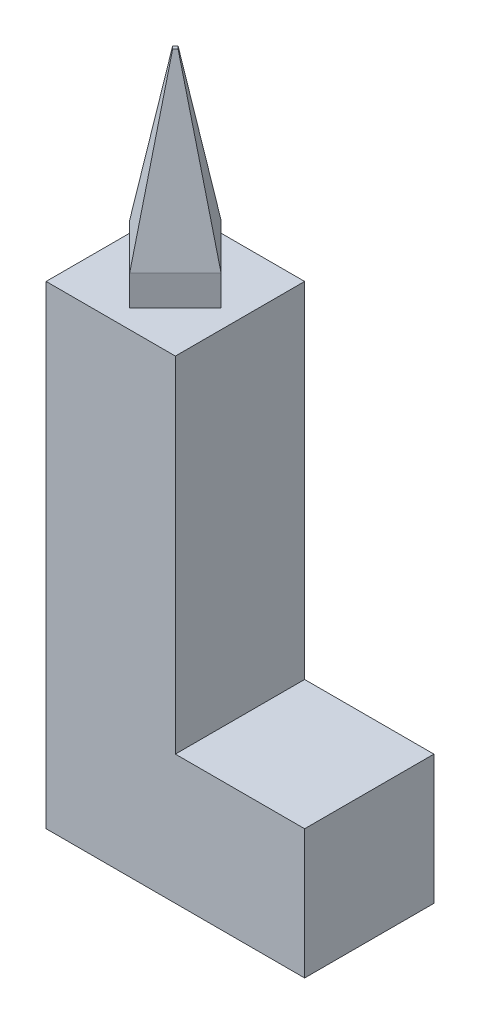
ISO-10303-21;
HEADER;
FILE_DESCRIPTION(('STEP AP214'),'2;1');
FILE_NAME('part.step','',(''),(''),'','','');
FILE_SCHEMA(('AUTOMOTIVE_DESIGN { 1 0 10303 214 1 1 1 1 }'));
ENDSEC;
DATA;
#1=APPLICATION_CONTEXT('core data for automotive mechanical design processes');
#2=APPLICATION_PROTOCOL_DEFINITION('international standard','automotive_design',2000,#1);
#3=PRODUCT_CONTEXT('',#1,'mechanical');
#4=PRODUCT('Part','Part','',(#3));
#5=PRODUCT_RELATED_PRODUCT_CATEGORY('part','',(#4));
#6=PRODUCT_DEFINITION_FORMATION('','',#4);
#7=PRODUCT_DEFINITION_CONTEXT('part definition',#1,'design');
#8=PRODUCT_DEFINITION('design','',#6,#7);
#9=PRODUCT_DEFINITION_SHAPE('','',#8);
#10=(LENGTH_UNIT() NAMED_UNIT(*) SI_UNIT(.MILLI.,.METRE.));
#11=(NAMED_UNIT(*) PLANE_ANGLE_UNIT() SI_UNIT($,.RADIAN.));
#12=(NAMED_UNIT(*) SI_UNIT($,.STERADIAN.) SOLID_ANGLE_UNIT());
#13=UNCERTAINTY_MEASURE_WITH_UNIT(LENGTH_MEASURE(1.E-05),#10,'distance_accuracy_value','');
#14=(GEOMETRIC_REPRESENTATION_CONTEXT(3) GLOBAL_UNCERTAINTY_ASSIGNED_CONTEXT((#13)) GLOBAL_UNIT_ASSIGNED_CONTEXT((#10,
#11,#12)) REPRESENTATION_CONTEXT('',''));
#15=CARTESIAN_POINT('',(0.,0.,0.));
#16=DIRECTION('',(0.,0.,1.));
#17=DIRECTION('',(1.,0.,0.));
#18=AXIS2_PLACEMENT_3D('',#15,#16,#17);
#19=CARTESIAN_POINT('',(0.,110.,0.));
#20=DIRECTION('',(0.,1.,0.));
#21=DIRECTION('',(0.,0.,1.));
#22=AXIS2_PLACEMENT_3D('',#19,#20,#21);
#23=PLANE('',#22);
#24=DIRECTION('',(0.,0.,1.));
#25=VECTOR('',#24,1.);
#26=CARTESIAN_POINT('',(0.,110.,0.));
#27=LINE('',#26,#25);
#28=CARTESIAN_POINT('',(0.,110.,0.));
#29=VERTEX_POINT('',#28);
#30=CARTESIAN_POINT('',(0.,110.,30.));
#31=VERTEX_POINT('',#30);
#32=EDGE_CURVE('E155',#29,#31,#27,.T.);
#33=ORIENTED_EDGE('',*,*,#32,.T.);
#34=DIRECTION('',(1.,0.,0.));
#35=VECTOR('',#34,1.);
#36=CARTESIAN_POINT('',(0.,110.,30.));
#37=LINE('',#36,#35);
#38=CARTESIAN_POINT('',(30.,110.,30.));
#39=VERTEX_POINT('',#38);
#40=EDGE_CURVE('E158',#31,#39,#37,.T.);
#41=ORIENTED_EDGE('',*,*,#40,.T.);
#42=DIRECTION('',(0.,0.,-1.));
#43=VECTOR('',#42,1.);
#44=CARTESIAN_POINT('',(30.,110.,0.));
#45=LINE('',#44,#43);
#46=CARTESIAN_POINT('',(30.,110.,0.));
#47=VERTEX_POINT('',#46);
#48=EDGE_CURVE('E160',#39,#47,#45,.T.);
#49=ORIENTED_EDGE('',*,*,#48,.T.);
#50=DIRECTION('',(-1.,0.,0.));
#51=VECTOR('',#50,1.);
#52=CARTESIAN_POINT('',(0.,110.,0.));
#53=LINE('',#52,#51);
#54=EDGE_CURVE('E162',#47,#29,#53,.T.);
#55=ORIENTED_EDGE('',*,*,#54,.T.);
#56=EDGE_LOOP('',(#33,#41,#49,#55));
#57=FACE_BOUND('',#56,.T.);
#58=DIRECTION('',(0.707106781186547,0.,-0.707106781186548));
#59=VECTOR('',#58,1.);
#60=CARTESIAN_POINT('',(15.,110.,25.6066017177982));
#61=LINE('',#60,#59);
#62=CARTESIAN_POINT('',(15.,110.,25.6066017177982));
#63=VERTEX_POINT('',#62);
#64=CARTESIAN_POINT('',(25.6066017177982,110.,15.));
#65=VERTEX_POINT('',#64);
#66=EDGE_CURVE('E128',#63,#65,#61,.T.);
#67=ORIENTED_EDGE('',*,*,#66,.F.);
#68=DIRECTION('',(0.707106781186547,0.,0.707106781186547));
#69=VECTOR('',#68,1.);
#70=CARTESIAN_POINT('',(4.39339828220179,110.,15.));
#71=LINE('',#70,#69);
#72=CARTESIAN_POINT('',(4.39339828220179,110.,15.));
#73=VERTEX_POINT('',#72);
#74=EDGE_CURVE('E136',#73,#63,#71,.T.);
#75=ORIENTED_EDGE('',*,*,#74,.F.);
#76=DIRECTION('',(-0.707106781186547,0.,0.707106781186548));
#77=VECTOR('',#76,1.);
#78=CARTESIAN_POINT('',(4.39339828220179,110.,15.));
#79=LINE('',#78,#77);
#80=CARTESIAN_POINT('',(15.,110.,4.39339828220179));
#81=VERTEX_POINT('',#80);
#82=EDGE_CURVE('E147',#81,#73,#79,.T.);
#83=ORIENTED_EDGE('',*,*,#82,.F.);
#84=DIRECTION('',(-0.707106781186547,0.,-0.707106781186548));
#85=VECTOR('',#84,1.);
#86=CARTESIAN_POINT('',(15.,110.,4.39339828220179));
#87=LINE('',#86,#85);
#88=EDGE_CURVE('E145',#65,#81,#87,.T.);
#89=ORIENTED_EDGE('',*,*,#88,.F.);
#90=EDGE_LOOP('',(#67,#75,#83,#89));
#91=FACE_BOUND('',#90,.T.);
#92=ADVANCED_FACE('F36',(#57,#91),#23,.T.);
#93=CARTESIAN_POINT('',(0.,30.,0.));
#94=DIRECTION('',(1.,0.,0.));
#95=DIRECTION('',(0.,0.,-1.));
#96=AXIS2_PLACEMENT_3D('',#93,#94,#95);
#97=PLANE('',#96);
#98=DIRECTION('',(0.,0.,1.));
#99=VECTOR('',#98,1.);
#100=CARTESIAN_POINT('',(0.,0.,0.));
#101=LINE('',#100,#99);
#102=CARTESIAN_POINT('',(0.,0.,0.));
#103=VERTEX_POINT('',#102);
#104=CARTESIAN_POINT('',(0.,0.,30.));
#105=VERTEX_POINT('',#104);
#106=EDGE_CURVE('E184',#103,#105,#101,.T.);
#107=ORIENTED_EDGE('',*,*,#106,.T.);
#108=DIRECTION('',(0.,-1.,0.));
#109=VECTOR('',#108,1.);
#110=CARTESIAN_POINT('',(0.,30.,30.));
#111=LINE('',#110,#109);
#112=EDGE_CURVE('E190',#31,#105,#111,.T.);
#113=ORIENTED_EDGE('',*,*,#112,.F.);
#114=ORIENTED_EDGE('',*,*,#32,.F.);
#115=DIRECTION('',(0.,-1.,0.));
#116=VECTOR('',#115,1.);
#117=CARTESIAN_POINT('',(0.,30.,0.));
#118=LINE('',#117,#116);
#119=EDGE_CURVE('E412',#29,#103,#118,.T.);
#120=ORIENTED_EDGE('',*,*,#119,.T.);
#121=EDGE_LOOP('',(#107,#113,#114,#120));
#122=FACE_BOUND('',#121,.T.);
#123=ADVANCED_FACE('F237',(#122),#97,.F.);
#124=CARTESIAN_POINT('',(0.,30.,30.));
#125=DIRECTION('',(0.,0.,-1.));
#126=DIRECTION('',(-1.,0.,0.));
#127=AXIS2_PLACEMENT_3D('',#124,#125,#126);
#128=PLANE('',#127);
#129=DIRECTION('',(1.,0.,0.));
#130=VECTOR('',#129,1.);
#131=CARTESIAN_POINT('',(0.,0.,30.));
#132=LINE('',#131,#130);
#133=CARTESIAN_POINT('',(60.,0.,30.));
#134=VERTEX_POINT('',#133);
#135=EDGE_CURVE('E389',#105,#134,#132,.T.);
#136=ORIENTED_EDGE('',*,*,#135,.T.);
#137=DIRECTION('',(0.,-1.,0.));
#138=VECTOR('',#137,1.);
#139=CARTESIAN_POINT('',(60.,30.,30.));
#140=LINE('',#139,#138);
#141=CARTESIAN_POINT('',(60.,30.,30.));
#142=VERTEX_POINT('',#141);
#143=EDGE_CURVE('E392',#142,#134,#140,.T.);
#144=ORIENTED_EDGE('',*,*,#143,.F.);
#145=DIRECTION('',(1.,0.,0.));
#146=VECTOR('',#145,1.);
#147=CARTESIAN_POINT('',(0.,30.,30.));
#148=LINE('',#147,#146);
#149=CARTESIAN_POINT('',(30.,30.,30.));
#150=VERTEX_POINT('',#149);
#151=EDGE_CURVE('E408',#150,#142,#148,.T.);
#152=ORIENTED_EDGE('',*,*,#151,.F.);
#153=DIRECTION('',(0.,-1.,0.));
#154=VECTOR('',#153,1.);
#155=CARTESIAN_POINT('',(30.,110.,30.));
#156=LINE('',#155,#154);
#157=EDGE_CURVE('E179',#39,#150,#156,.T.);
#158=ORIENTED_EDGE('',*,*,#157,.F.);
#159=ORIENTED_EDGE('',*,*,#40,.F.);
#160=ORIENTED_EDGE('',*,*,#112,.T.);
#161=EDGE_LOOP('',(#136,#144,#152,#158,#159,#160));
#162=FACE_BOUND('',#161,.T.);
#163=ADVANCED_FACE('F243',(#162),#128,.F.);
#164=CARTESIAN_POINT('',(60.,30.,0.));
#165=DIRECTION('',(-1.,0.,0.));
#166=DIRECTION('',(0.,0.,1.));
#167=AXIS2_PLACEMENT_3D('',#164,#165,#166);
#168=PLANE('',#167);
#169=DIRECTION('',(0.,0.,-1.));
#170=VECTOR('',#169,1.);
#171=CARTESIAN_POINT('',(60.,0.,0.));
#172=LINE('',#171,#170);
#173=CARTESIAN_POINT('',(60.,0.,0.));
#174=VERTEX_POINT('',#173);
#175=EDGE_CURVE('E398',#134,#174,#172,.T.);
#176=ORIENTED_EDGE('',*,*,#175,.T.);
#177=DIRECTION('',(0.,-1.,0.));
#178=VECTOR('',#177,1.);
#179=CARTESIAN_POINT('',(60.,30.,0.));
#180=LINE('',#179,#178);
#181=CARTESIAN_POINT('',(60.,30.,0.));
#182=VERTEX_POINT('',#181);
#183=EDGE_CURVE('E403',#182,#174,#180,.T.);
#184=ORIENTED_EDGE('',*,*,#183,.F.);
#185=DIRECTION('',(0.,0.,-1.));
#186=VECTOR('',#185,1.);
#187=CARTESIAN_POINT('',(60.,30.,0.));
#188=LINE('',#187,#186);
#189=EDGE_CURVE('E402',#142,#182,#188,.T.);
#190=ORIENTED_EDGE('',*,*,#189,.F.);
#191=ORIENTED_EDGE('',*,*,#143,.T.);
#192=EDGE_LOOP('',(#176,#184,#190,#191));
#193=FACE_BOUND('',#192,.T.);
#194=ADVANCED_FACE('F264',(#193),#168,.F.);
#195=CARTESIAN_POINT('',(0.,30.,0.));
#196=DIRECTION('',(0.,0.,1.));
#197=DIRECTION('',(1.,0.,0.));
#198=AXIS2_PLACEMENT_3D('',#195,#196,#197);
#199=PLANE('',#198);
#200=DIRECTION('',(-1.,0.,0.));
#201=VECTOR('',#200,1.);
#202=CARTESIAN_POINT('',(0.,0.,0.));
#203=LINE('',#202,#201);
#204=EDGE_CURVE('E406',#174,#103,#203,.T.);
#205=ORIENTED_EDGE('',*,*,#204,.T.);
#206=ORIENTED_EDGE('',*,*,#119,.F.);
#207=ORIENTED_EDGE('',*,*,#54,.F.);
#208=DIRECTION('',(0.,-1.,0.));
#209=VECTOR('',#208,1.);
#210=CARTESIAN_POINT('',(30.,110.,0.));
#211=LINE('',#210,#209);
#212=CARTESIAN_POINT('',(30.,30.,0.));
#213=VERTEX_POINT('',#212);
#214=EDGE_CURVE('E165',#47,#213,#211,.T.);
#215=ORIENTED_EDGE('',*,*,#214,.T.);
#216=DIRECTION('',(-1.,0.,0.));
#217=VECTOR('',#216,1.);
#218=CARTESIAN_POINT('',(0.,30.,0.));
#219=LINE('',#218,#217);
#220=EDGE_CURVE('E174',#182,#213,#219,.T.);
#221=ORIENTED_EDGE('',*,*,#220,.F.);
#222=ORIENTED_EDGE('',*,*,#183,.T.);
#223=EDGE_LOOP('',(#205,#206,#207,#215,#221,#222));
#224=FACE_BOUND('',#223,.T.);
#225=ADVANCED_FACE('F257',(#224),#199,.F.);
#226=CARTESIAN_POINT('',(0.,30.,0.));
#227=DIRECTION('',(0.,1.,0.));
#228=DIRECTION('',(0.,0.,1.));
#229=AXIS2_PLACEMENT_3D('',#226,#227,#228);
#230=PLANE('',#229);
#231=DIRECTION('',(0.,0.,-1.));
#232=VECTOR('',#231,1.);
#233=CARTESIAN_POINT('',(30.,30.,0.));
#234=LINE('',#233,#232);
#235=EDGE_CURVE('E132',#150,#213,#234,.T.);
#236=ORIENTED_EDGE('',*,*,#235,.F.);
#237=ORIENTED_EDGE('',*,*,#151,.T.);
#238=ORIENTED_EDGE('',*,*,#189,.T.);
#239=ORIENTED_EDGE('',*,*,#220,.T.);
#240=EDGE_LOOP('',(#236,#237,#238,#239));
#241=FACE_BOUND('',#240,.T.);
#242=ADVANCED_FACE('F254',(#241),#230,.T.);
#243=CARTESIAN_POINT('',(0.,0.,0.));
#244=DIRECTION('',(0.,1.,0.));
#245=DIRECTION('',(0.,0.,1.));
#246=AXIS2_PLACEMENT_3D('',#243,#244,#245);
#247=PLANE('',#246);
#248=ORIENTED_EDGE('',*,*,#106,.F.);
#249=ORIENTED_EDGE('',*,*,#204,.F.);
#250=ORIENTED_EDGE('',*,*,#175,.F.);
#251=ORIENTED_EDGE('',*,*,#135,.F.);
#252=EDGE_LOOP('',(#248,#249,#250,#251));
#253=FACE_BOUND('',#252,.T.);
#254=ADVANCED_FACE('F252',(#253),#247,.F.);
#255=CARTESIAN_POINT('',(30.,110.,0.));
#256=DIRECTION('',(-1.,0.,0.));
#257=DIRECTION('',(0.,0.,1.));
#258=AXIS2_PLACEMENT_3D('',#255,#256,#257);
#259=PLANE('',#258);
#260=ORIENTED_EDGE('',*,*,#235,.T.);
#261=ORIENTED_EDGE('',*,*,#214,.F.);
#262=ORIENTED_EDGE('',*,*,#48,.F.);
#263=ORIENTED_EDGE('',*,*,#157,.T.);
#264=EDGE_LOOP('',(#260,#261,#262,#263));
#265=FACE_BOUND('',#264,.T.);
#266=ADVANCED_FACE('F249',(#265),#259,.F.);
#267=CARTESIAN_POINT('',(4.39339828220179,157.,15.));
#268=DIRECTION('',(0.707106781186548,0.,-0.707106781186547));
#269=DIRECTION('',(-0.707106781186547,0.,-0.707106781186548));
#270=AXIS2_PLACEMENT_3D('',#267,#268,#269);
#271=PLANE('',#270);
#272=DIRECTION('',(0.,-1.,0.));
#273=VECTOR('',#272,1.);
#274=CARTESIAN_POINT('',(15.,157.,25.6066017177982));
#275=LINE('',#274,#273);
#276=CARTESIAN_POINT('',(15.,116.999999999999,25.6066017177982));
#277=VERTEX_POINT('',#276);
#278=EDGE_CURVE('E124',#277,#63,#275,.T.);
#279=ORIENTED_EDGE('',*,*,#278,.F.);
#280=DIRECTION('',(-0.707106781186547,0.,-0.707106781186548));
#281=VECTOR('',#280,1.);
#282=CARTESIAN_POINT('',(4.39339828220179,116.999999999999,15.));
#283=LINE('',#282,#281);
#284=CARTESIAN_POINT('',(4.39339828220179,116.999999999999,15.));
#285=VERTEX_POINT('',#284);
#286=EDGE_CURVE('E11',#277,#285,#283,.T.);
#287=ORIENTED_EDGE('',*,*,#286,.T.);
#288=DIRECTION('',(0.,-1.,0.));
#289=VECTOR('',#288,1.);
#290=CARTESIAN_POINT('',(4.39339828220179,157.,15.));
#291=LINE('',#290,#289);
#292=EDGE_CURVE('E139',#285,#73,#291,.T.);
#293=ORIENTED_EDGE('',*,*,#292,.T.);
#294=ORIENTED_EDGE('',*,*,#74,.T.);
#295=EDGE_LOOP('',(#279,#287,#293,#294));
#296=FACE_BOUND('',#295,.T.);
#297=ADVANCED_FACE('F137',(#296),#271,.F.);
#298=CARTESIAN_POINT('',(15.,157.,25.6066017177982));
#299=DIRECTION('',(-0.707106781186547,0.,-0.707106781186547));
#300=DIRECTION('',(-0.707106781186548,0.,0.707106781186548));
#301=AXIS2_PLACEMENT_3D('',#298,#299,#300);
#302=PLANE('',#301);
#303=DIRECTION('',(0.,-1.,0.));
#304=VECTOR('',#303,1.);
#305=CARTESIAN_POINT('',(25.6066017177982,157.,15.));
#306=LINE('',#305,#304);
#307=CARTESIAN_POINT('',(25.6066017177982,116.999999999999,15.));
#308=VERTEX_POINT('',#307);
#309=EDGE_CURVE('E133',#308,#65,#306,.T.);
#310=ORIENTED_EDGE('',*,*,#309,.F.);
#311=DIRECTION('',(-0.707106781186548,0.,0.707106781186548));
#312=VECTOR('',#311,1.);
#313=CARTESIAN_POINT('',(15.,116.999999999999,25.6066017177982));
#314=LINE('',#313,#312);
#315=EDGE_CURVE('E45',#308,#277,#314,.T.);
#316=ORIENTED_EDGE('',*,*,#315,.T.);
#317=ORIENTED_EDGE('',*,*,#278,.T.);
#318=ORIENTED_EDGE('',*,*,#66,.T.);
#319=EDGE_LOOP('',(#310,#316,#317,#318));
#320=FACE_BOUND('',#319,.T.);
#321=ADVANCED_FACE('F126',(#320),#302,.F.);
#322=CARTESIAN_POINT('',(15.,157.,4.39339828220179));
#323=DIRECTION('',(-0.707106781186548,0.,0.707106781186547));
#324=DIRECTION('',(0.707106781186547,0.,0.707106781186548));
#325=AXIS2_PLACEMENT_3D('',#322,#323,#324);
#326=PLANE('',#325);
#327=DIRECTION('',(0.,-1.,0.));
#328=VECTOR('',#327,1.);
#329=CARTESIAN_POINT('',(15.,157.,4.39339828220179));
#330=LINE('',#329,#328);
#331=CARTESIAN_POINT('',(15.,116.999999999999,4.39339828220179));
#332=VERTEX_POINT('',#331);
#333=EDGE_CURVE('E152',#332,#81,#330,.T.);
#334=ORIENTED_EDGE('',*,*,#333,.F.);
#335=DIRECTION('',(0.707106781186547,0.,0.707106781186548));
#336=VECTOR('',#335,1.);
#337=CARTESIAN_POINT('',(25.6066017177982,116.999999999999,15.));
#338=LINE('',#337,#336);
#339=EDGE_CURVE('E60',#332,#308,#338,.T.);
#340=ORIENTED_EDGE('',*,*,#339,.T.);
#341=ORIENTED_EDGE('',*,*,#309,.T.);
#342=ORIENTED_EDGE('',*,*,#88,.T.);
#343=EDGE_LOOP('',(#334,#340,#341,#342));
#344=FACE_BOUND('',#343,.T.);
#345=ADVANCED_FACE('F234',(#344),#326,.F.);
#346=CARTESIAN_POINT('',(4.39339828220179,157.,15.));
#347=DIRECTION('',(0.707106781186547,0.,0.707106781186547));
#348=DIRECTION('',(0.707106781186548,0.,-0.707106781186548));
#349=AXIS2_PLACEMENT_3D('',#346,#347,#348);
#350=PLANE('',#349);
#351=ORIENTED_EDGE('',*,*,#292,.F.);
#352=DIRECTION('',(0.707106781186548,0.,-0.707106781186548));
#353=VECTOR('',#352,1.);
#354=CARTESIAN_POINT('',(15.,116.999999999999,4.39339828220179));
#355=LINE('',#354,#353);
#356=EDGE_CURVE('E197',#285,#332,#355,.T.);
#357=ORIENTED_EDGE('',*,*,#356,.T.);
#358=ORIENTED_EDGE('',*,*,#333,.T.);
#359=ORIENTED_EDGE('',*,*,#82,.T.);
#360=EDGE_LOOP('',(#351,#357,#358,#359));
#361=FACE_BOUND('',#360,.T.);
#362=ADVANCED_FACE('F222',(#361),#350,.F.);
#363=CARTESIAN_POINT('',(0.,157.,0.));
#364=DIRECTION('',(0.,1.,0.));
#365=DIRECTION('',(0.,0.,1.));
#366=AXIS2_PLACEMENT_3D('',#363,#364,#365);
#367=PLANE('',#366);
#368=DIRECTION('',(-0.707106781186547,0.,-0.707106781186548));
#369=VECTOR('',#368,1.);
#370=CARTESIAN_POINT('',(10.0127198493958,157.,9.38067843280601));
#371=LINE('',#370,#369);
#372=CARTESIAN_POINT('',(15.6320414165898,157.,15.));
#373=VERTEX_POINT('',#372);
#374=CARTESIAN_POINT('',(15.,157.,14.3679585834102));
#375=VERTEX_POINT('',#374);
#376=EDGE_CURVE('E192',#373,#375,#371,.T.);
#377=ORIENTED_EDGE('',*,*,#376,.T.);
#378=DIRECTION('',(-0.707106781186548,0.,0.707106781186548));
#379=VECTOR('',#378,1.);
#380=CARTESIAN_POINT('',(9.38067843280602,157.,19.9872801506042));
#381=LINE('',#380,#379);
#382=CARTESIAN_POINT('',(14.3679585834102,157.,15.));
#383=VERTEX_POINT('',#382);
#384=EDGE_CURVE('E194',#375,#383,#381,.T.);
#385=ORIENTED_EDGE('',*,*,#384,.T.);
#386=DIRECTION('',(0.707106781186547,0.,0.707106781186548));
#387=VECTOR('',#386,1.);
#388=CARTESIAN_POINT('',(19.9872801506042,157.,20.619321567194));
#389=LINE('',#388,#387);
#390=CARTESIAN_POINT('',(15.,157.,15.6320414165898));
#391=VERTEX_POINT('',#390);
#392=EDGE_CURVE('E187',#383,#391,#389,.T.);
#393=ORIENTED_EDGE('',*,*,#392,.T.);
#394=DIRECTION('',(0.707106781186548,0.,-0.707106781186548));
#395=VECTOR('',#394,1.);
#396=CARTESIAN_POINT('',(20.619321567194,157.,10.0127198493958));
#397=LINE('',#396,#395);
#398=EDGE_CURVE('E189',#391,#373,#397,.T.);
#399=ORIENTED_EDGE('',*,*,#398,.T.);
#400=EDGE_LOOP('',(#377,#385,#393,#399));
#401=FACE_BOUND('',#400,.T.);
#402=ADVANCED_FACE('F227',(#401),#367,.T.);
#403=CARTESIAN_POINT('',(15.3160207082949,157.,15.3160207082949));
#404=DIRECTION('',(0.696364240320019,0.173648177666928,0.696364240320019));
#405=DIRECTION('',(-0.707106781186548,0.,0.707106781186548));
#406=AXIS2_PLACEMENT_3D('',#403,#404,#405);
#407=PLANE('',#406);
#408=DIRECTION('',(0.,0.970287525247815,-0.241954785752361));
#409=VECTOR('',#408,1.);
#410=CARTESIAN_POINT('',(15.,160.595676480392,14.7354091196571));
#411=LINE('',#410,#409);
#412=EDGE_CURVE('E205',#277,#391,#411,.T.);
#413=ORIENTED_EDGE('',*,*,#412,.F.);
#414=ORIENTED_EDGE('',*,*,#315,.F.);
#415=DIRECTION('',(-0.241954785752361,0.970287525247815,0.));
#416=VECTOR('',#415,1.);
#417=CARTESIAN_POINT('',(15.6135408948842,157.074190826049,15.));
#418=LINE('',#417,#416);
#419=EDGE_CURVE('E40',#373,#308,#418,.F.);
#420=ORIENTED_EDGE('',*,*,#419,.F.);
#421=ORIENTED_EDGE('',*,*,#398,.F.);
#422=EDGE_LOOP('',(#413,#414,#420,#421));
#423=FACE_BOUND('',#422,.T.);
#424=ADVANCED_FACE('F38',(#423),#407,.T.);
#425=CARTESIAN_POINT('',(0.316020708294885,157.,-0.316020708294885));
#426=DIRECTION('',(0.696364240320019,0.173648177666927,-0.696364240320019));
#427=DIRECTION('',(0.707106781186547,0.,0.707106781186548));
#428=AXIS2_PLACEMENT_3D('',#425,#426,#427);
#429=PLANE('',#428);
#430=ORIENTED_EDGE('',*,*,#419,.T.);
#431=ORIENTED_EDGE('',*,*,#339,.F.);
#432=DIRECTION('',(0.,0.970287525247815,0.241954785752361));
#433=VECTOR('',#432,1.);
#434=CARTESIAN_POINT('',(15.,153.552705171706,13.5083273298887));
#435=LINE('',#434,#433);
#436=EDGE_CURVE('E204',#375,#332,#435,.F.);
#437=ORIENTED_EDGE('',*,*,#436,.F.);
#438=ORIENTED_EDGE('',*,*,#376,.F.);
#439=EDGE_LOOP('',(#430,#431,#437,#438));
#440=FACE_BOUND('',#439,.T.);
#441=ADVANCED_FACE('F214',(#440),#429,.T.);
#442=CARTESIAN_POINT('',(-0.316020708294875,157.,0.316020708294874));
#443=DIRECTION('',(-0.696364240320019,0.173648177666928,0.696364240320019));
#444=DIRECTION('',(-0.707106781186547,0.,-0.707106781186548));
#445=AXIS2_PLACEMENT_3D('',#442,#443,#444);
#446=PLANE('',#445);
#447=ORIENTED_EDGE('',*,*,#412,.T.);
#448=ORIENTED_EDGE('',*,*,#392,.F.);
#449=DIRECTION('',(-0.241954785752361,-0.970287525247815,0.));
#450=VECTOR('',#449,1.);
#451=CARTESIAN_POINT('',(13.5083273298887,153.552705171706,15.));
#452=LINE('',#451,#450);
#453=EDGE_CURVE('E202',#285,#383,#452,.F.);
#454=ORIENTED_EDGE('',*,*,#453,.F.);
#455=ORIENTED_EDGE('',*,*,#286,.F.);
#456=EDGE_LOOP('',(#447,#448,#454,#455));
#457=FACE_BOUND('',#456,.T.);
#458=ADVANCED_FACE('F219',(#457),#446,.T.);
#459=CARTESIAN_POINT('',(14.6839792917051,157.,14.6839792917051));
#460=DIRECTION('',(-0.696364240320019,0.173648177666927,-0.696364240320019));
#461=DIRECTION('',(0.707106781186548,0.,-0.707106781186548));
#462=AXIS2_PLACEMENT_3D('',#459,#460,#461);
#463=PLANE('',#462);
#464=ORIENTED_EDGE('',*,*,#436,.T.);
#465=ORIENTED_EDGE('',*,*,#356,.F.);
#466=ORIENTED_EDGE('',*,*,#453,.T.);
#467=ORIENTED_EDGE('',*,*,#384,.F.);
#468=EDGE_LOOP('',(#464,#465,#466,#467));
#469=FACE_BOUND('',#468,.T.);
#470=ADVANCED_FACE('F224',(#469),#463,.T.);
#471=CLOSED_SHELL('',(#92,#123,#163,#194,#225,#242,#254,#266,#297,#321,#345,#362,#402,#424,#441,
#458,#470));
#472=MANIFOLD_SOLID_BREP('B2',#471);
#473=ADVANCED_BREP_SHAPE_REPRESENTATION('',(#18,#472),#14);
#474=SHAPE_DEFINITION_REPRESENTATION(#9,#473);
ENDSEC;
END-ISO-10303-21;
